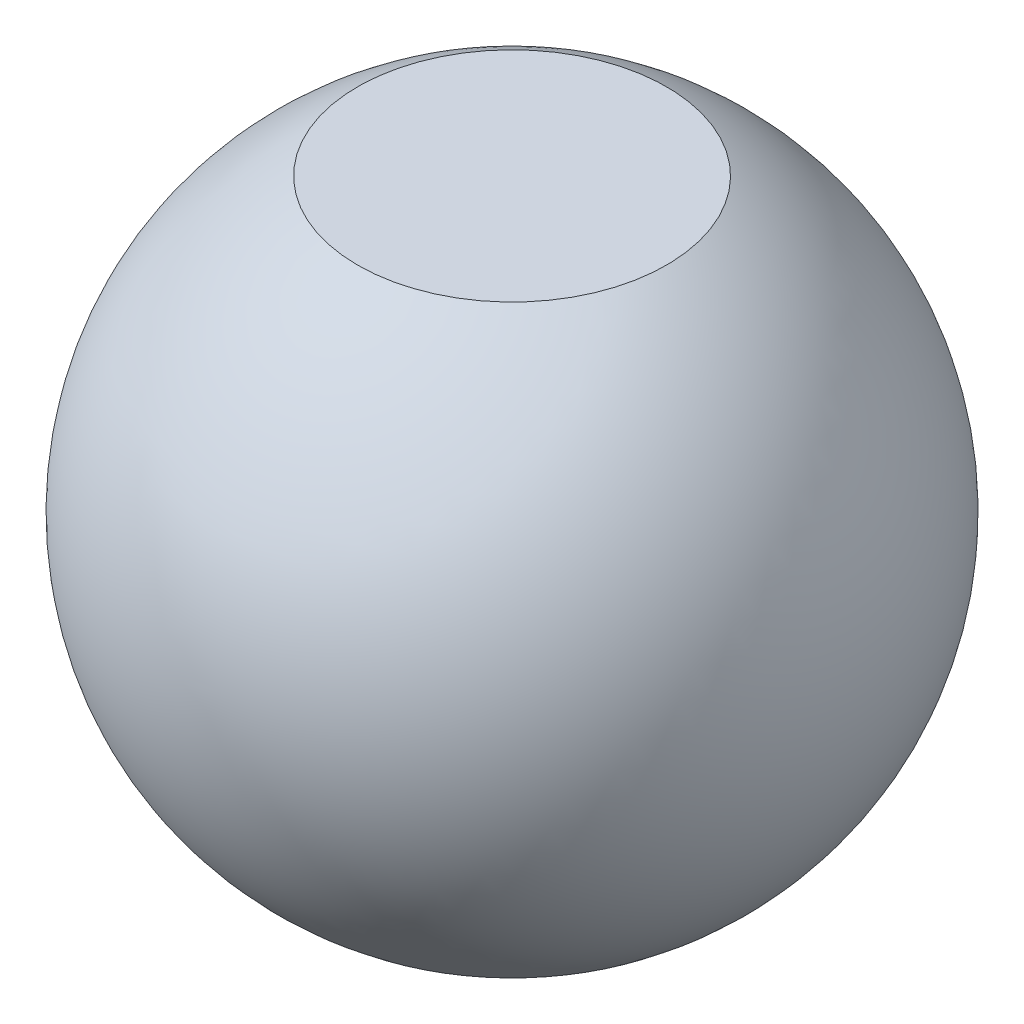
ISO-10303-21;
HEADER;
FILE_DESCRIPTION(('STEP AP214'),'2;1');
FILE_NAME('part.step','',(''),(''),'','','');
FILE_SCHEMA(('AUTOMOTIVE_DESIGN { 1 0 10303 214 1 1 1 1 }'));
ENDSEC;
DATA;
#1=APPLICATION_CONTEXT('core data for automotive mechanical design processes');
#2=APPLICATION_PROTOCOL_DEFINITION('international standard','automotive_design',2000,#1);
#3=PRODUCT_CONTEXT('',#1,'mechanical');
#4=PRODUCT('Part','Part','',(#3));
#5=PRODUCT_RELATED_PRODUCT_CATEGORY('part','',(#4));
#6=PRODUCT_DEFINITION_FORMATION('','',#4);
#7=PRODUCT_DEFINITION_CONTEXT('part definition',#1,'design');
#8=PRODUCT_DEFINITION('design','',#6,#7);
#9=PRODUCT_DEFINITION_SHAPE('','',#8);
#10=(LENGTH_UNIT() NAMED_UNIT(*) SI_UNIT(.MILLI.,.METRE.));
#11=(NAMED_UNIT(*) PLANE_ANGLE_UNIT() SI_UNIT($,.RADIAN.));
#12=(NAMED_UNIT(*) SI_UNIT($,.STERADIAN.) SOLID_ANGLE_UNIT());
#13=UNCERTAINTY_MEASURE_WITH_UNIT(LENGTH_MEASURE(1.E-05),#10,'distance_accuracy_value','');
#14=(GEOMETRIC_REPRESENTATION_CONTEXT(3) GLOBAL_UNCERTAINTY_ASSIGNED_CONTEXT((#13)) GLOBAL_UNIT_ASSIGNED_CONTEXT((#10,
#11,#12)) REPRESENTATION_CONTEXT('',''));
#15=CARTESIAN_POINT('',(0.,0.,0.));
#16=DIRECTION('',(0.,0.,1.));
#17=DIRECTION('',(1.,0.,0.));
#18=AXIS2_PLACEMENT_3D('',#15,#16,#17);
#19=CARTESIAN_POINT('',(0.,0.,0.));
#20=DIRECTION('',(0.,0.,-1.));
#21=DIRECTION('',(1.,0.,0.));
#22=AXIS2_PLACEMENT_3D('',#19,#20,#21);
#23=SPHERICAL_SURFACE('',#22,15.);
#24=CARTESIAN_POINT('',(0.,0.,0.));
#25=DIRECTION('',(0.,1.,0.));
#26=DIRECTION('',(0.,0.,1.));
#27=AXIS2_PLACEMENT_3D('',#24,#25,#26);
#28=SPHERICAL_SURFACE('',#27,15.);
#29=CARTESIAN_POINT('',(0.,13.25,0.));
#30=DIRECTION('',(0.,1.,0.));
#31=DIRECTION('',(0.,0.,1.));
#32=AXIS2_PLACEMENT_3D('',#29,#30,#31);
#33=CIRCLE('',#32,7.03118055521262);
#34=CARTESIAN_POINT('',(0.,13.25,7.03118055521262));
#35=VERTEX_POINT('',#34);
#36=EDGE_CURVE('E47',#35,#35,#33,.T.);
#37=ORIENTED_EDGE('',*,*,#36,.F.);
#38=EDGE_LOOP('',(#37));
#39=FACE_BOUND('',#38,.T.);
#40=ADVANCED_FACE('F91',(#39),#28,.T.);
#41=CARTESIAN_POINT('',(29.8201668343852,13.25,21.0559828738457));
#42=DIRECTION('',(0.,1.,0.));
#43=DIRECTION('',(0.,0.,1.));
#44=AXIS2_PLACEMENT_3D('',#41,#42,#43);
#45=PLANE('',#44);
#46=ORIENTED_EDGE('',*,*,#36,.T.);
#47=EDGE_LOOP('',(#46));
#48=FACE_BOUND('',#47,.T.);
#49=ADVANCED_FACE('F98',(#48),#45,.T.);
#50=CLOSED_SHELL('',(#40,#49));
#51=MANIFOLD_SOLID_BREP('B6',#50);
#52=ADVANCED_BREP_SHAPE_REPRESENTATION('',(#18,#51),#14);
#53=SHAPE_DEFINITION_REPRESENTATION(#9,#52);
ENDSEC;
END-ISO-10303-21;
